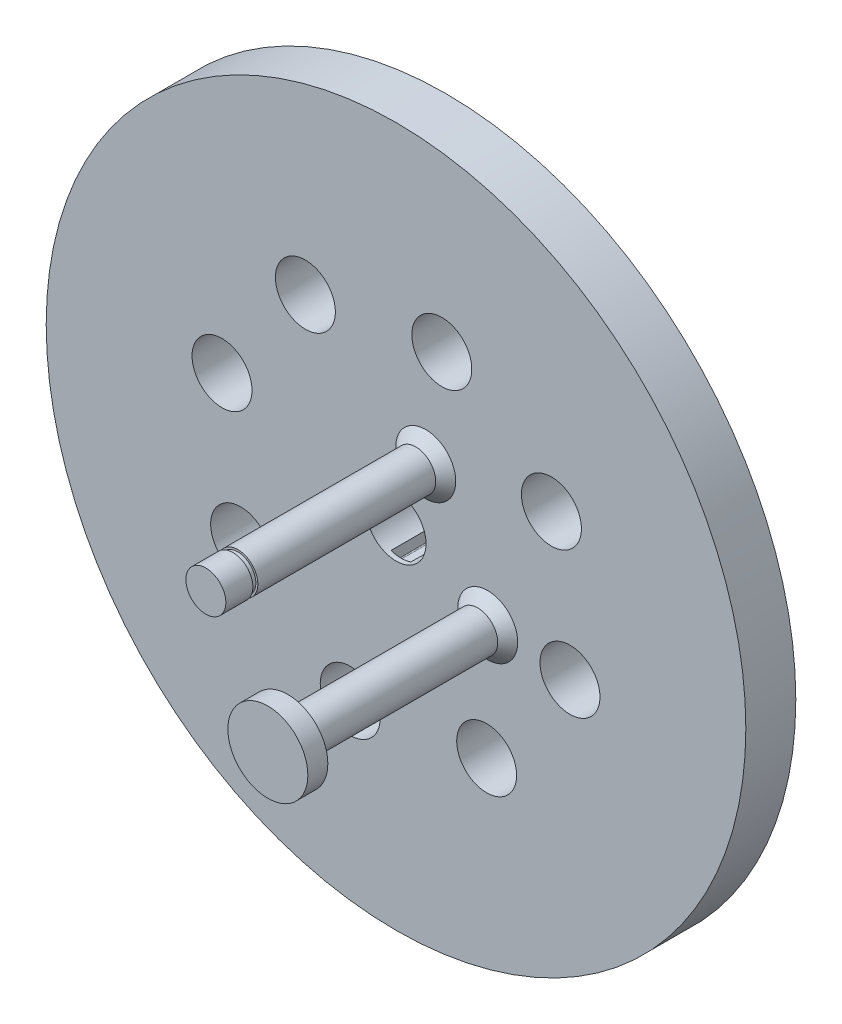
ISO-10303-21;
HEADER;
FILE_DESCRIPTION(('STEP AP214'),'2;1');
FILE_NAME('part.step','',(''),(''),'','','');
FILE_SCHEMA(('AUTOMOTIVE_DESIGN { 1 0 10303 214 1 1 1 1 }'));
ENDSEC;
DATA;
#1=APPLICATION_CONTEXT('core data for automotive mechanical design processes');
#2=APPLICATION_PROTOCOL_DEFINITION('international standard','automotive_design',2000,#1);
#3=PRODUCT_CONTEXT('',#1,'mechanical');
#4=PRODUCT('Part','Part','',(#3));
#5=PRODUCT_RELATED_PRODUCT_CATEGORY('part','',(#4));
#6=PRODUCT_DEFINITION_FORMATION('','',#4);
#7=PRODUCT_DEFINITION_CONTEXT('part definition',#1,'design');
#8=PRODUCT_DEFINITION('design','',#6,#7);
#9=PRODUCT_DEFINITION_SHAPE('','',#8);
#10=(LENGTH_UNIT() NAMED_UNIT(*) SI_UNIT(.MILLI.,.METRE.));
#11=(NAMED_UNIT(*) PLANE_ANGLE_UNIT() SI_UNIT($,.RADIAN.));
#12=(NAMED_UNIT(*) SI_UNIT($,.STERADIAN.) SOLID_ANGLE_UNIT());
#13=UNCERTAINTY_MEASURE_WITH_UNIT(LENGTH_MEASURE(1.E-05),#10,'distance_accuracy_value','');
#14=(GEOMETRIC_REPRESENTATION_CONTEXT(3) GLOBAL_UNCERTAINTY_ASSIGNED_CONTEXT((#13)) GLOBAL_UNIT_ASSIGNED_CONTEXT((#10,
#11,#12)) REPRESENTATION_CONTEXT('',''));
#15=CARTESIAN_POINT('',(0.,0.,0.));
#16=DIRECTION('',(0.,0.,1.));
#17=DIRECTION('',(1.,0.,0.));
#18=AXIS2_PLACEMENT_3D('',#15,#16,#17);
#19=CARTESIAN_POINT('',(0.,0.,5.));
#20=DIRECTION('',(0.,0.,-1.));
#21=DIRECTION('',(-1.,0.,0.));
#22=AXIS2_PLACEMENT_3D('',#19,#20,#21);
#23=CYLINDRICAL_SURFACE('',#22,3.);
#24=CARTESIAN_POINT('',(0.,0.,5.));
#25=DIRECTION('',(0.,0.,1.));
#26=DIRECTION('',(1.,0.,0.));
#27=AXIS2_PLACEMENT_3D('',#24,#25,#26);
#28=CIRCLE('',#27,3.);
#29=CARTESIAN_POINT('',(3.,0.,5.));
#30=VERTEX_POINT('',#29);
#31=EDGE_CURVE('E272',#30,#30,#28,.T.);
#32=ORIENTED_EDGE('',*,*,#31,.T.);
#33=EDGE_LOOP('',(#32));
#34=FACE_BOUND('',#33,.T.);
#35=CARTESIAN_POINT('',(0.,0.,0.));
#36=DIRECTION('',(0.,0.,1.));
#37=DIRECTION('',(1.,0.,0.));
#38=AXIS2_PLACEMENT_3D('',#35,#36,#37);
#39=CIRCLE('',#38,3.);
#40=CARTESIAN_POINT('',(3.,0.,0.));
#41=VERTEX_POINT('',#40);
#42=EDGE_CURVE('E268',#41,#41,#39,.T.);
#43=ORIENTED_EDGE('',*,*,#42,.F.);
#44=EDGE_LOOP('',(#43));
#45=FACE_BOUND('',#44,.T.);
#46=DIRECTION('',(0.,0.,-1.));
#47=VECTOR('',#46,1.);
#48=CARTESIAN_POINT('',(-0.999999999999999,-2.82842712474619,5.));
#49=LINE('',#48,#47);
#50=CARTESIAN_POINT('',(-0.999999999999999,-2.82842712474619,0.5));
#51=VERTEX_POINT('',#50);
#52=CARTESIAN_POINT('',(-0.999999999999999,-2.82842712474619,4.5));
#53=VERTEX_POINT('',#52);
#54=EDGE_CURVE('E129',#51,#53,#49,.F.);
#55=ORIENTED_EDGE('',*,*,#54,.F.);
#56=CARTESIAN_POINT('',(0.,0.,0.5));
#57=DIRECTION('',(0.,0.,1.));
#58=DIRECTION('',(1.,0.,0.));
#59=AXIS2_PLACEMENT_3D('',#56,#57,#58);
#60=CIRCLE('',#59,3.);
#61=CARTESIAN_POINT('',(1.,-2.82842712474619,0.5));
#62=VERTEX_POINT('',#61);
#63=EDGE_CURVE('E132',#51,#62,#60,.T.);
#64=ORIENTED_EDGE('',*,*,#63,.T.);
#65=DIRECTION('',(0.,0.,-1.));
#66=VECTOR('',#65,1.);
#67=CARTESIAN_POINT('',(1.,-2.82842712474619,5.));
#68=LINE('',#67,#66);
#69=CARTESIAN_POINT('',(1.,-2.82842712474619,4.5));
#70=VERTEX_POINT('',#69);
#71=EDGE_CURVE('E114',#70,#62,#68,.T.);
#72=ORIENTED_EDGE('',*,*,#71,.F.);
#73=CARTESIAN_POINT('',(0.,0.,4.5));
#74=DIRECTION('',(0.,0.,1.));
#75=DIRECTION('',(1.,0.,0.));
#76=AXIS2_PLACEMENT_3D('',#73,#74,#75);
#77=CIRCLE('',#76,3.);
#78=EDGE_CURVE('E122',#53,#70,#77,.T.);
#79=ORIENTED_EDGE('',*,*,#78,.F.);
#80=EDGE_LOOP('',(#55,#64,#72,#79));
#81=FACE_BOUND('',#80,.T.);
#82=ADVANCED_FACE('F53',(#34,#45,#81),#23,.F.);
#83=CARTESIAN_POINT('',(9.17867077053944,-3.96887929849786,27.));
#84=DIRECTION('',(0.,0.,-1.));
#85=DIRECTION('',(-1.,0.,0.));
#86=AXIS2_PLACEMENT_3D('',#83,#84,#85);
#87=CYLINDRICAL_SURFACE('',#86,2.);
#88=CARTESIAN_POINT('',(9.17867077053944,-3.96887929849786,6.00000000000001));
#89=DIRECTION('',(0.,0.,1.));
#90=DIRECTION('',(1.,0.,0.));
#91=AXIS2_PLACEMENT_3D('',#88,#89,#90);
#92=CIRCLE('',#91,2.);
#93=CARTESIAN_POINT('',(11.1786707705394,-3.96887929849786,6.00000000000001));
#94=VERTEX_POINT('',#93);
#95=EDGE_CURVE('E291',#94,#94,#92,.T.);
#96=ORIENTED_EDGE('',*,*,#95,.T.);
#97=EDGE_LOOP('',(#96));
#98=FACE_BOUND('',#97,.T.);
#99=CARTESIAN_POINT('',(9.17867077053944,-3.96887929849786,25.));
#100=DIRECTION('',(0.,0.,1.));
#101=DIRECTION('',(1.,0.,0.));
#102=AXIS2_PLACEMENT_3D('',#99,#100,#101);
#103=CIRCLE('',#102,2.);
#104=CARTESIAN_POINT('',(11.1786707705394,-3.96887929849786,25.));
#105=VERTEX_POINT('',#104);
#106=EDGE_CURVE('E284',#105,#105,#103,.T.);
#107=ORIENTED_EDGE('',*,*,#106,.F.);
#108=EDGE_LOOP('',(#107));
#109=FACE_BOUND('',#108,.T.);
#110=ADVANCED_FACE('F327',(#98,#109),#87,.T.);
#111=CARTESIAN_POINT('',(2.97665947387337,6.88400307790459,27.));
#112=DIRECTION('',(0.,0.,-1.));
#113=DIRECTION('',(-1.,0.,0.));
#114=AXIS2_PLACEMENT_3D('',#111,#112,#113);
#115=CYLINDRICAL_SURFACE('',#114,2.);
#116=CARTESIAN_POINT('',(2.97665947387337,6.88400307790459,6.00000000000001));
#117=DIRECTION('',(0.,0.,1.));
#118=DIRECTION('',(1.,0.,0.));
#119=AXIS2_PLACEMENT_3D('',#116,#117,#118);
#120=CIRCLE('',#119,2.);
#121=CARTESIAN_POINT('',(4.97665947387337,6.88400307790459,6.00000000000001));
#122=VERTEX_POINT('',#121);
#123=EDGE_CURVE('E130',#122,#122,#120,.T.);
#124=ORIENTED_EDGE('',*,*,#123,.T.);
#125=EDGE_LOOP('',(#124));
#126=FACE_BOUND('',#125,.T.);
#127=CARTESIAN_POINT('',(2.97665947387337,6.88400307790459,23.8));
#128=DIRECTION('',(0.,0.,1.));
#129=DIRECTION('',(1.,0.,0.));
#130=AXIS2_PLACEMENT_3D('',#127,#128,#129);
#131=CIRCLE('',#130,2.);
#132=CARTESIAN_POINT('',(4.97665947387337,6.88400307790459,23.8));
#133=VERTEX_POINT('',#132);
#134=EDGE_CURVE('E192',#133,#133,#131,.T.);
#135=ORIENTED_EDGE('',*,*,#134,.F.);
#136=EDGE_LOOP('',(#135));
#137=FACE_BOUND('',#136,.T.);
#138=ADVANCED_FACE('F307',(#126,#137),#115,.T.);
#139=CARTESIAN_POINT('',(0.,0.,5.));
#140=DIRECTION('',(0.,0.,1.));
#141=DIRECTION('',(1.,0.,0.));
#142=AXIS2_PLACEMENT_3D('',#139,#140,#141);
#143=PLANE('',#142);
#144=CARTESIAN_POINT('',(9.17867077053944,-3.96887929849786,5.));
#145=DIRECTION('',(0.,0.,1.));
#146=DIRECTION('',(1.,0.,0.));
#147=AXIS2_PLACEMENT_3D('',#144,#145,#146);
#148=CIRCLE('',#147,3.);
#149=CARTESIAN_POINT('',(12.1786707705394,-3.96887929849786,5.));
#150=VERTEX_POINT('',#149);
#151=EDGE_CURVE('E299',#150,#150,#148,.F.);
#152=ORIENTED_EDGE('',*,*,#151,.T.);
#153=EDGE_LOOP('',(#152));
#154=FACE_BOUND('',#153,.T.);
#155=CARTESIAN_POINT('',(2.97665947387337,6.88400307790459,5.));
#156=DIRECTION('',(0.,0.,1.));
#157=DIRECTION('',(1.,0.,0.));
#158=AXIS2_PLACEMENT_3D('',#155,#156,#157);
#159=CIRCLE('',#158,3.);
#160=CARTESIAN_POINT('',(5.97665947387337,6.88400307790459,5.));
#161=VERTEX_POINT('',#160);
#162=EDGE_CURVE('E295',#161,#161,#159,.F.);
#163=ORIENTED_EDGE('',*,*,#162,.T.);
#164=EDGE_LOOP('',(#163));
#165=FACE_BOUND('',#164,.T.);
#166=CARTESIAN_POINT('',(15.548658842396,9.06858358305098,5.));
#167=DIRECTION('',(0.,0.,-1.));
#168=DIRECTION('',(-1.,0.,0.));
#169=AXIS2_PLACEMENT_3D('',#166,#167,#168);
#170=CIRCLE('',#169,3.);
#171=CARTESIAN_POINT('',(12.548658842396,9.06858358305098,5.));
#172=VERTEX_POINT('',#171);
#173=EDGE_CURVE('E207',#172,#172,#170,.T.);
#174=ORIENTED_EDGE('',*,*,#173,.T.);
#175=EDGE_LOOP('',(#174));
#176=FACE_BOUND('',#175,.T.);
#177=CARTESIAN_POINT('',(17.4070190531467,-4.58210515848203,5.));
#178=DIRECTION('',(0.,0.,-1.));
#179=DIRECTION('',(-1.,0.,0.));
#180=AXIS2_PLACEMENT_3D('',#177,#178,#179);
#181=CIRCLE('',#180,3.);
#182=CARTESIAN_POINT('',(14.4070190531467,-4.58210515848203,5.));
#183=VERTEX_POINT('',#182);
#184=EDGE_CURVE('E253',#183,#183,#181,.T.);
#185=ORIENTED_EDGE('',*,*,#184,.T.);
#186=EDGE_LOOP('',(#185));
#187=FACE_BOUND('',#186,.T.);
#188=CARTESIAN_POINT('',(9.06858358305099,-15.5486588423959,5.));
#189=DIRECTION('',(0.,0.,-1.));
#190=DIRECTION('',(-1.,0.,0.));
#191=AXIS2_PLACEMENT_3D('',#188,#189,#190);
#192=CIRCLE('',#191,3.);
#193=CARTESIAN_POINT('',(6.06858358305099,-15.5486588423959,5.));
#194=VERTEX_POINT('',#193);
#195=EDGE_CURVE('E245',#194,#194,#192,.T.);
#196=ORIENTED_EDGE('',*,*,#195,.T.);
#197=EDGE_LOOP('',(#196));
#198=FACE_BOUND('',#197,.T.);
#199=CARTESIAN_POINT('',(-4.58210515848203,-17.4070190531467,5.));
#200=DIRECTION('',(0.,0.,-1.));
#201=DIRECTION('',(-1.,0.,0.));
#202=AXIS2_PLACEMENT_3D('',#199,#200,#201);
#203=CIRCLE('',#202,3.);
#204=CARTESIAN_POINT('',(-7.58210515848203,-17.4070190531467,5.));
#205=VERTEX_POINT('',#204);
#206=EDGE_CURVE('E237',#205,#205,#203,.T.);
#207=ORIENTED_EDGE('',*,*,#206,.T.);
#208=EDGE_LOOP('',(#207));
#209=FACE_BOUND('',#208,.T.);
#210=CARTESIAN_POINT('',(-15.548658842396,-9.06858358305097,5.));
#211=DIRECTION('',(0.,0.,-1.));
#212=DIRECTION('',(-1.,0.,0.));
#213=AXIS2_PLACEMENT_3D('',#210,#211,#212);
#214=CIRCLE('',#213,3.);
#215=CARTESIAN_POINT('',(-18.548658842396,-9.06858358305097,5.));
#216=VERTEX_POINT('',#215);
#217=EDGE_CURVE('E229',#216,#216,#214,.T.);
#218=ORIENTED_EDGE('',*,*,#217,.T.);
#219=EDGE_LOOP('',(#218));
#220=FACE_BOUND('',#219,.T.);
#221=CARTESIAN_POINT('',(-17.4070190531467,4.58210515848202,5.));
#222=DIRECTION('',(0.,0.,-1.));
#223=DIRECTION('',(-1.,0.,0.));
#224=AXIS2_PLACEMENT_3D('',#221,#222,#223);
#225=CIRCLE('',#224,2.99999999999999);
#226=CARTESIAN_POINT('',(-20.4070190531467,4.58210515848202,5.));
#227=VERTEX_POINT('',#226);
#228=EDGE_CURVE('E221',#227,#227,#225,.T.);
#229=ORIENTED_EDGE('',*,*,#228,.T.);
#230=EDGE_LOOP('',(#229));
#231=FACE_BOUND('',#230,.T.);
#232=CARTESIAN_POINT('',(-9.06858358305098,15.548658842396,5.));
#233=DIRECTION('',(0.,0.,-1.));
#234=DIRECTION('',(-1.,0.,0.));
#235=AXIS2_PLACEMENT_3D('',#232,#233,#234);
#236=CIRCLE('',#235,3.);
#237=CARTESIAN_POINT('',(-12.068583583051,15.548658842396,5.));
#238=VERTEX_POINT('',#237);
#239=EDGE_CURVE('E213',#238,#238,#236,.T.);
#240=ORIENTED_EDGE('',*,*,#239,.T.);
#241=EDGE_LOOP('',(#240));
#242=FACE_BOUND('',#241,.T.);
#243=CARTESIAN_POINT('',(4.58210515848201,17.4070190531467,5.));
#244=DIRECTION('',(0.,0.,-1.));
#245=DIRECTION('',(-1.,0.,0.));
#246=AXIS2_PLACEMENT_3D('',#243,#244,#245);
#247=CIRCLE('',#246,3.);
#248=CARTESIAN_POINT('',(1.58210515848201,17.4070190531467,5.));
#249=VERTEX_POINT('',#248);
#250=EDGE_CURVE('E264',#249,#249,#247,.T.);
#251=ORIENTED_EDGE('',*,*,#250,.T.);
#252=EDGE_LOOP('',(#251));
#253=FACE_BOUND('',#252,.T.);
#254=CARTESIAN_POINT('',(0.,0.,5.));
#255=DIRECTION('',(0.,0.,1.));
#256=DIRECTION('',(1.,0.,0.));
#257=AXIS2_PLACEMENT_3D('',#254,#255,#256);
#258=CIRCLE('',#257,35.);
#259=CARTESIAN_POINT('',(35.,0.,5.));
#260=VERTEX_POINT('',#259);
#261=EDGE_CURVE('E280',#260,#260,#258,.T.);
#262=ORIENTED_EDGE('',*,*,#261,.T.);
#263=EDGE_LOOP('',(#262));
#264=FACE_BOUND('',#263,.T.);
#265=ORIENTED_EDGE('',*,*,#31,.F.);
#266=EDGE_LOOP('',(#265));
#267=FACE_BOUND('',#266,.T.);
#268=ADVANCED_FACE('F341',(#154,#165,#176,#187,#198,#209,#220,#231,#242,#253,#264,#267),#143,.T.);
#269=CARTESIAN_POINT('',(0.,0.,0.));
#270=DIRECTION('',(0.,0.,1.));
#271=DIRECTION('',(1.,0.,0.));
#272=AXIS2_PLACEMENT_3D('',#269,#270,#271);
#273=PLANE('',#272);
#274=CARTESIAN_POINT('',(15.548658842396,9.06858358305098,0.));
#275=DIRECTION('',(0.,0.,-1.));
#276=DIRECTION('',(-1.,0.,0.));
#277=AXIS2_PLACEMENT_3D('',#274,#275,#276);
#278=CIRCLE('',#277,3.);
#279=CARTESIAN_POINT('',(12.548658842396,9.06858358305098,0.));
#280=VERTEX_POINT('',#279);
#281=EDGE_CURVE('E257',#280,#280,#278,.T.);
#282=ORIENTED_EDGE('',*,*,#281,.F.);
#283=EDGE_LOOP('',(#282));
#284=FACE_BOUND('',#283,.T.);
#285=CARTESIAN_POINT('',(17.4070190531467,-4.58210515848203,0.));
#286=DIRECTION('',(0.,0.,-1.));
#287=DIRECTION('',(-1.,0.,0.));
#288=AXIS2_PLACEMENT_3D('',#285,#286,#287);
#289=CIRCLE('',#288,3.);
#290=CARTESIAN_POINT('',(14.4070190531467,-4.58210515848203,0.));
#291=VERTEX_POINT('',#290);
#292=EDGE_CURVE('E249',#291,#291,#289,.T.);
#293=ORIENTED_EDGE('',*,*,#292,.F.);
#294=EDGE_LOOP('',(#293));
#295=FACE_BOUND('',#294,.T.);
#296=CARTESIAN_POINT('',(9.06858358305099,-15.5486588423959,0.));
#297=DIRECTION('',(0.,0.,-1.));
#298=DIRECTION('',(-1.,0.,0.));
#299=AXIS2_PLACEMENT_3D('',#296,#297,#298);
#300=CIRCLE('',#299,3.);
#301=CARTESIAN_POINT('',(6.06858358305099,-15.5486588423959,0.));
#302=VERTEX_POINT('',#301);
#303=EDGE_CURVE('E241',#302,#302,#300,.T.);
#304=ORIENTED_EDGE('',*,*,#303,.F.);
#305=EDGE_LOOP('',(#304));
#306=FACE_BOUND('',#305,.T.);
#307=CARTESIAN_POINT('',(-4.58210515848203,-17.4070190531467,0.));
#308=DIRECTION('',(0.,0.,-1.));
#309=DIRECTION('',(-1.,0.,0.));
#310=AXIS2_PLACEMENT_3D('',#307,#308,#309);
#311=CIRCLE('',#310,3.);
#312=CARTESIAN_POINT('',(-7.58210515848203,-17.4070190531467,0.));
#313=VERTEX_POINT('',#312);
#314=EDGE_CURVE('E233',#313,#313,#311,.T.);
#315=ORIENTED_EDGE('',*,*,#314,.F.);
#316=EDGE_LOOP('',(#315));
#317=FACE_BOUND('',#316,.T.);
#318=CARTESIAN_POINT('',(-15.548658842396,-9.06858358305097,0.));
#319=DIRECTION('',(0.,0.,-1.));
#320=DIRECTION('',(-1.,0.,0.));
#321=AXIS2_PLACEMENT_3D('',#318,#319,#320);
#322=CIRCLE('',#321,3.);
#323=CARTESIAN_POINT('',(-18.548658842396,-9.06858358305097,0.));
#324=VERTEX_POINT('',#323);
#325=EDGE_CURVE('E225',#324,#324,#322,.T.);
#326=ORIENTED_EDGE('',*,*,#325,.F.);
#327=EDGE_LOOP('',(#326));
#328=FACE_BOUND('',#327,.T.);
#329=CARTESIAN_POINT('',(-17.4070190531467,4.58210515848202,0.));
#330=DIRECTION('',(0.,0.,-1.));
#331=DIRECTION('',(-1.,0.,0.));
#332=AXIS2_PLACEMENT_3D('',#329,#330,#331);
#333=CIRCLE('',#332,2.99999999999999);
#334=CARTESIAN_POINT('',(-20.4070190531467,4.58210515848202,0.));
#335=VERTEX_POINT('',#334);
#336=EDGE_CURVE('E217',#335,#335,#333,.T.);
#337=ORIENTED_EDGE('',*,*,#336,.F.);
#338=EDGE_LOOP('',(#337));
#339=FACE_BOUND('',#338,.T.);
#340=CARTESIAN_POINT('',(-9.06858358305098,15.548658842396,0.));
#341=DIRECTION('',(0.,0.,-1.));
#342=DIRECTION('',(-1.,0.,0.));
#343=AXIS2_PLACEMENT_3D('',#340,#341,#342);
#344=CIRCLE('',#343,3.);
#345=CARTESIAN_POINT('',(-12.068583583051,15.548658842396,0.));
#346=VERTEX_POINT('',#345);
#347=EDGE_CURVE('E208',#346,#346,#344,.T.);
#348=ORIENTED_EDGE('',*,*,#347,.F.);
#349=EDGE_LOOP('',(#348));
#350=FACE_BOUND('',#349,.T.);
#351=CARTESIAN_POINT('',(4.58210515848201,17.4070190531467,0.));
#352=DIRECTION('',(0.,0.,-1.));
#353=DIRECTION('',(-1.,0.,0.));
#354=AXIS2_PLACEMENT_3D('',#351,#352,#353);
#355=CIRCLE('',#354,3.);
#356=CARTESIAN_POINT('',(1.58210515848201,17.4070190531467,0.));
#357=VERTEX_POINT('',#356);
#358=EDGE_CURVE('E212',#357,#357,#355,.T.);
#359=ORIENTED_EDGE('',*,*,#358,.F.);
#360=EDGE_LOOP('',(#359));
#361=FACE_BOUND('',#360,.T.);
#362=CARTESIAN_POINT('',(0.,0.,0.));
#363=DIRECTION('',(0.,0.,1.));
#364=DIRECTION('',(1.,0.,0.));
#365=AXIS2_PLACEMENT_3D('',#362,#363,#364);
#366=CIRCLE('',#365,35.);
#367=CARTESIAN_POINT('',(35.,0.,0.));
#368=VERTEX_POINT('',#367);
#369=EDGE_CURVE('E276',#368,#368,#366,.T.);
#370=ORIENTED_EDGE('',*,*,#369,.F.);
#371=EDGE_LOOP('',(#370));
#372=FACE_BOUND('',#371,.T.);
#373=ORIENTED_EDGE('',*,*,#42,.T.);
#374=EDGE_LOOP('',(#373));
#375=FACE_BOUND('',#374,.T.);
#376=ADVANCED_FACE('F343',(#284,#295,#306,#317,#328,#339,#350,#361,#372,#375),#273,.F.);
#377=CARTESIAN_POINT('',(0.,0.,5.));
#378=DIRECTION('',(0.,0.,-1.));
#379=DIRECTION('',(-1.,0.,0.));
#380=AXIS2_PLACEMENT_3D('',#377,#378,#379);
#381=CYLINDRICAL_SURFACE('',#380,35.);
#382=ORIENTED_EDGE('',*,*,#261,.F.);
#383=EDGE_LOOP('',(#382));
#384=FACE_BOUND('',#383,.T.);
#385=ORIENTED_EDGE('',*,*,#369,.T.);
#386=EDGE_LOOP('',(#385));
#387=FACE_BOUND('',#386,.T.);
#388=ADVANCED_FACE('F347',(#384,#387),#381,.T.);
#389=CARTESIAN_POINT('',(4.58210515848201,17.4070190531467,5.));
#390=DIRECTION('',(0.,0.,-1.));
#391=DIRECTION('',(-1.,0.,0.));
#392=AXIS2_PLACEMENT_3D('',#389,#390,#391);
#393=CYLINDRICAL_SURFACE('',#392,3.);
#394=ORIENTED_EDGE('',*,*,#250,.F.);
#395=EDGE_LOOP('',(#394));
#396=FACE_BOUND('',#395,.T.);
#397=ORIENTED_EDGE('',*,*,#358,.T.);
#398=EDGE_LOOP('',(#397));
#399=FACE_BOUND('',#398,.T.);
#400=ADVANCED_FACE('F339',(#396,#399),#393,.F.);
#401=CARTESIAN_POINT('',(-9.06858358305098,15.548658842396,5.));
#402=DIRECTION('',(0.,0.,-1.));
#403=DIRECTION('',(-1.,0.,0.));
#404=AXIS2_PLACEMENT_3D('',#401,#402,#403);
#405=CYLINDRICAL_SURFACE('',#404,3.);
#406=ORIENTED_EDGE('',*,*,#239,.F.);
#407=EDGE_LOOP('',(#406));
#408=FACE_BOUND('',#407,.T.);
#409=ORIENTED_EDGE('',*,*,#347,.T.);
#410=EDGE_LOOP('',(#409));
#411=FACE_BOUND('',#410,.T.);
#412=ADVANCED_FACE('F359',(#408,#411),#405,.F.);
#413=CARTESIAN_POINT('',(-17.4070190531467,4.58210515848202,5.));
#414=DIRECTION('',(0.,0.,-1.));
#415=DIRECTION('',(-1.,0.,0.));
#416=AXIS2_PLACEMENT_3D('',#413,#414,#415);
#417=CYLINDRICAL_SURFACE('',#416,2.99999999999999);
#418=ORIENTED_EDGE('',*,*,#228,.F.);
#419=EDGE_LOOP('',(#418));
#420=FACE_BOUND('',#419,.T.);
#421=ORIENTED_EDGE('',*,*,#336,.T.);
#422=EDGE_LOOP('',(#421));
#423=FACE_BOUND('',#422,.T.);
#424=ADVANCED_FACE('F374',(#420,#423),#417,.F.);
#425=CARTESIAN_POINT('',(-15.548658842396,-9.06858358305097,5.));
#426=DIRECTION('',(0.,0.,-1.));
#427=DIRECTION('',(-1.,0.,0.));
#428=AXIS2_PLACEMENT_3D('',#425,#426,#427);
#429=CYLINDRICAL_SURFACE('',#428,3.);
#430=ORIENTED_EDGE('',*,*,#217,.F.);
#431=EDGE_LOOP('',(#430));
#432=FACE_BOUND('',#431,.T.);
#433=ORIENTED_EDGE('',*,*,#325,.T.);
#434=EDGE_LOOP('',(#433));
#435=FACE_BOUND('',#434,.T.);
#436=ADVANCED_FACE('F385',(#432,#435),#429,.F.);
#437=CARTESIAN_POINT('',(-4.58210515848203,-17.4070190531467,5.));
#438=DIRECTION('',(0.,0.,-1.));
#439=DIRECTION('',(-1.,0.,0.));
#440=AXIS2_PLACEMENT_3D('',#437,#438,#439);
#441=CYLINDRICAL_SURFACE('',#440,3.);
#442=ORIENTED_EDGE('',*,*,#206,.F.);
#443=EDGE_LOOP('',(#442));
#444=FACE_BOUND('',#443,.T.);
#445=ORIENTED_EDGE('',*,*,#314,.T.);
#446=EDGE_LOOP('',(#445));
#447=FACE_BOUND('',#446,.T.);
#448=ADVANCED_FACE('F396',(#444,#447),#441,.F.);
#449=CARTESIAN_POINT('',(9.06858358305099,-15.5486588423959,5.));
#450=DIRECTION('',(0.,0.,-1.));
#451=DIRECTION('',(-1.,0.,0.));
#452=AXIS2_PLACEMENT_3D('',#449,#450,#451);
#453=CYLINDRICAL_SURFACE('',#452,3.);
#454=ORIENTED_EDGE('',*,*,#195,.F.);
#455=EDGE_LOOP('',(#454));
#456=FACE_BOUND('',#455,.T.);
#457=ORIENTED_EDGE('',*,*,#303,.T.);
#458=EDGE_LOOP('',(#457));
#459=FACE_BOUND('',#458,.T.);
#460=ADVANCED_FACE('F400',(#456,#459),#453,.F.);
#461=CARTESIAN_POINT('',(17.4070190531467,-4.58210515848203,5.));
#462=DIRECTION('',(0.,0.,-1.));
#463=DIRECTION('',(-1.,0.,0.));
#464=AXIS2_PLACEMENT_3D('',#461,#462,#463);
#465=CYLINDRICAL_SURFACE('',#464,3.);
#466=ORIENTED_EDGE('',*,*,#184,.F.);
#467=EDGE_LOOP('',(#466));
#468=FACE_BOUND('',#467,.T.);
#469=ORIENTED_EDGE('',*,*,#292,.T.);
#470=EDGE_LOOP('',(#469));
#471=FACE_BOUND('',#470,.T.);
#472=ADVANCED_FACE('F404',(#468,#471),#465,.F.);
#473=CARTESIAN_POINT('',(15.548658842396,9.06858358305098,5.));
#474=DIRECTION('',(0.,0.,-1.));
#475=DIRECTION('',(-1.,0.,0.));
#476=AXIS2_PLACEMENT_3D('',#473,#474,#475);
#477=CYLINDRICAL_SURFACE('',#476,3.);
#478=ORIENTED_EDGE('',*,*,#173,.F.);
#479=EDGE_LOOP('',(#478));
#480=FACE_BOUND('',#479,.T.);
#481=ORIENTED_EDGE('',*,*,#281,.T.);
#482=EDGE_LOOP('',(#481));
#483=FACE_BOUND('',#482,.T.);
#484=ADVANCED_FACE('F407',(#480,#483),#477,.F.);
#485=CARTESIAN_POINT('',(2.97665947387337,6.88400307790459,24.3));
#486=DIRECTION('',(0.,0.,1.));
#487=DIRECTION('',(1.,0.,0.));
#488=AXIS2_PLACEMENT_3D('',#485,#486,#487);
#489=PLANE('',#488);
#490=CARTESIAN_POINT('',(2.97665947387337,6.88400307790459,24.3));
#491=DIRECTION('',(0.,0.,1.));
#492=DIRECTION('',(1.,0.,0.));
#493=AXIS2_PLACEMENT_3D('',#490,#491,#492);
#494=CIRCLE('',#493,2.);
#495=CARTESIAN_POINT('',(4.97665947387337,6.88400307790459,24.3));
#496=VERTEX_POINT('',#495);
#497=EDGE_CURVE('E196',#496,#496,#494,.T.);
#498=ORIENTED_EDGE('',*,*,#497,.F.);
#499=EDGE_LOOP('',(#498));
#500=FACE_BOUND('',#499,.T.);
#501=CARTESIAN_POINT('',(2.97665947387337,6.88400307790459,24.3));
#502=DIRECTION('',(0.,0.,1.));
#503=DIRECTION('',(1.,0.,0.));
#504=AXIS2_PLACEMENT_3D('',#501,#502,#503);
#505=CIRCLE('',#504,1.8);
#506=CARTESIAN_POINT('',(4.77665947387337,6.88400307790459,24.3));
#507=VERTEX_POINT('',#506);
#508=EDGE_CURVE('E188',#507,#507,#505,.T.);
#509=ORIENTED_EDGE('',*,*,#508,.T.);
#510=EDGE_LOOP('',(#509));
#511=FACE_BOUND('',#510,.T.);
#512=ADVANCED_FACE('F410',(#500,#511),#489,.F.);
#513=CARTESIAN_POINT('',(2.97665947387337,6.88400307790459,23.8));
#514=DIRECTION('',(0.,0.,1.));
#515=DIRECTION('',(1.,0.,0.));
#516=AXIS2_PLACEMENT_3D('',#513,#514,#515);
#517=PLANE('',#516);
#518=ORIENTED_EDGE('',*,*,#134,.T.);
#519=EDGE_LOOP('',(#518));
#520=FACE_BOUND('',#519,.T.);
#521=CARTESIAN_POINT('',(2.97665947387337,6.88400307790459,23.8));
#522=DIRECTION('',(0.,0.,1.));
#523=DIRECTION('',(1.,0.,0.));
#524=AXIS2_PLACEMENT_3D('',#521,#522,#523);
#525=CIRCLE('',#524,1.8);
#526=CARTESIAN_POINT('',(4.77665947387337,6.88400307790459,23.8));
#527=VERTEX_POINT('',#526);
#528=EDGE_CURVE('E184',#527,#527,#525,.T.);
#529=ORIENTED_EDGE('',*,*,#528,.F.);
#530=EDGE_LOOP('',(#529));
#531=FACE_BOUND('',#530,.T.);
#532=ADVANCED_FACE('F416',(#520,#531),#517,.T.);
#533=CARTESIAN_POINT('',(2.97665947387337,6.88400307790459,24.3));
#534=DIRECTION('',(0.,0.,-1.));
#535=DIRECTION('',(-1.,0.,0.));
#536=AXIS2_PLACEMENT_3D('',#533,#534,#535);
#537=CYLINDRICAL_SURFACE('',#536,1.8);
#538=ORIENTED_EDGE('',*,*,#508,.F.);
#539=EDGE_LOOP('',(#538));
#540=FACE_BOUND('',#539,.T.);
#541=ORIENTED_EDGE('',*,*,#528,.T.);
#542=EDGE_LOOP('',(#541));
#543=FACE_BOUND('',#542,.T.);
#544=ADVANCED_FACE('F454',(#540,#543),#537,.T.);
#545=CARTESIAN_POINT('',(2.97665947387337,6.88400307790459,27.));
#546=DIRECTION('',(0.,0.,1.));
#547=DIRECTION('',(1.,0.,0.));
#548=AXIS2_PLACEMENT_3D('',#545,#546,#547);
#549=PLANE('',#548);
#550=CARTESIAN_POINT('',(2.97665947387337,6.88400307790459,27.));
#551=DIRECTION('',(0.,0.,1.));
#552=DIRECTION('',(1.,0.,0.));
#553=AXIS2_PLACEMENT_3D('',#550,#551,#552);
#554=CIRCLE('',#553,2.);
#555=CARTESIAN_POINT('',(4.97665947387337,6.88400307790459,27.));
#556=VERTEX_POINT('',#555);
#557=EDGE_CURVE('E200',#556,#556,#554,.T.);
#558=ORIENTED_EDGE('',*,*,#557,.T.);
#559=EDGE_LOOP('',(#558));
#560=FACE_BOUND('',#559,.T.);
#561=ADVANCED_FACE('F465',(#560),#549,.T.);
#562=ORIENTED_EDGE('',*,*,#497,.T.);
#563=EDGE_LOOP('',(#562));
#564=FACE_BOUND('',#563,.T.);
#565=ORIENTED_EDGE('',*,*,#557,.F.);
#566=EDGE_LOOP('',(#565));
#567=FACE_BOUND('',#566,.T.);
#568=ADVANCED_FACE('F391',(#564,#567),#115,.T.);
#569=CARTESIAN_POINT('',(9.17867077053944,-3.96887929849786,25.));
#570=DIRECTION('',(0.,0.,1.));
#571=DIRECTION('',(1.,0.,0.));
#572=AXIS2_PLACEMENT_3D('',#569,#570,#571);
#573=CYLINDRICAL_SURFACE('',#572,4.);
#574=CARTESIAN_POINT('',(9.17867077053944,-3.96887929849786,25.));
#575=DIRECTION('',(0.,0.,1.));
#576=DIRECTION('',(1.,0.,0.));
#577=AXIS2_PLACEMENT_3D('',#574,#575,#576);
#578=CIRCLE('',#577,4.);
#579=CARTESIAN_POINT('',(13.1786707705394,-3.96887929849786,25.));
#580=VERTEX_POINT('',#579);
#581=EDGE_CURVE('E180',#580,#580,#578,.T.);
#582=ORIENTED_EDGE('',*,*,#581,.T.);
#583=EDGE_LOOP('',(#582));
#584=FACE_BOUND('',#583,.T.);
#585=CARTESIAN_POINT('',(9.17867077053944,-3.96887929849786,27.));
#586=DIRECTION('',(0.,0.,1.));
#587=DIRECTION('',(1.,0.,0.));
#588=AXIS2_PLACEMENT_3D('',#585,#586,#587);
#589=CIRCLE('',#588,4.);
#590=CARTESIAN_POINT('',(13.1786707705394,-3.96887929849786,27.));
#591=VERTEX_POINT('',#590);
#592=EDGE_CURVE('E169',#591,#591,#589,.T.);
#593=ORIENTED_EDGE('',*,*,#592,.F.);
#594=EDGE_LOOP('',(#593));
#595=FACE_BOUND('',#594,.T.);
#596=ADVANCED_FACE('F470',(#584,#595),#573,.T.);
#597=CARTESIAN_POINT('',(9.17867077053944,-3.96887929849786,25.));
#598=DIRECTION('',(0.,0.,1.));
#599=DIRECTION('',(1.,0.,0.));
#600=AXIS2_PLACEMENT_3D('',#597,#598,#599);
#601=PLANE('',#600);
#602=ORIENTED_EDGE('',*,*,#106,.T.);
#603=EDGE_LOOP('',(#602));
#604=FACE_BOUND('',#603,.T.);
#605=ORIENTED_EDGE('',*,*,#581,.F.);
#606=EDGE_LOOP('',(#605));
#607=FACE_BOUND('',#606,.T.);
#608=ADVANCED_FACE('F463',(#604,#607),#601,.F.);
#609=CARTESIAN_POINT('',(9.17867077053944,-3.96887929849786,27.));
#610=DIRECTION('',(0.,0.,1.));
#611=DIRECTION('',(1.,0.,0.));
#612=AXIS2_PLACEMENT_3D('',#609,#610,#611);
#613=PLANE('',#612);
#614=ORIENTED_EDGE('',*,*,#592,.T.);
#615=EDGE_LOOP('',(#614));
#616=FACE_BOUND('',#615,.T.);
#617=ADVANCED_FACE('F321',(#616),#613,.T.);
#618=CARTESIAN_POINT('',(9.17867077053944,-3.96887929849786,6.00000000000001));
#619=DIRECTION('',(0.,0.,-1.));
#620=DIRECTION('',(-1.,0.,0.));
#621=AXIS2_PLACEMENT_3D('',#618,#619,#620);
#622=CONICAL_SURFACE('',#621,2.,0.785398163397446);
#623=ORIENTED_EDGE('',*,*,#151,.F.);
#624=EDGE_LOOP('',(#623));
#625=FACE_BOUND('',#624,.T.);
#626=ORIENTED_EDGE('',*,*,#95,.F.);
#627=EDGE_LOOP('',(#626));
#628=FACE_BOUND('',#627,.T.);
#629=ADVANCED_FACE('F312',(#625,#628),#622,.T.);
#630=CARTESIAN_POINT('',(2.97665947387337,6.88400307790459,6.00000000000001));
#631=DIRECTION('',(0.,0.,-1.));
#632=DIRECTION('',(-1.,0.,0.));
#633=AXIS2_PLACEMENT_3D('',#630,#631,#632);
#634=CONICAL_SURFACE('',#633,2.,0.785398163397446);
#635=ORIENTED_EDGE('',*,*,#162,.F.);
#636=EDGE_LOOP('',(#635));
#637=FACE_BOUND('',#636,.T.);
#638=ORIENTED_EDGE('',*,*,#123,.F.);
#639=EDGE_LOOP('',(#638));
#640=FACE_BOUND('',#639,.T.);
#641=ADVANCED_FACE('F310',(#637,#640),#634,.T.);
#642=CARTESIAN_POINT('',(1.,-2.,0.5));
#643=DIRECTION('',(1.,0.,0.));
#644=DIRECTION('',(0.,0.,-1.));
#645=AXIS2_PLACEMENT_3D('',#642,#643,#644);
#646=PLANE('',#645);
#647=DIRECTION('',(0.,1.,0.));
#648=VECTOR('',#647,1.);
#649=CARTESIAN_POINT('',(1.,-2.,0.5));
#650=LINE('',#649,#648);
#651=CARTESIAN_POINT('',(1.,-3.9,0.5));
#652=VERTEX_POINT('',#651);
#653=EDGE_CURVE('E177',#652,#62,#650,.T.);
#654=ORIENTED_EDGE('',*,*,#653,.F.);
#655=DIRECTION('',(0.,0.,1.));
#656=VECTOR('',#655,1.);
#657=CARTESIAN_POINT('',(1.,-3.9,4.5));
#658=LINE('',#657,#656);
#659=CARTESIAN_POINT('',(1.,-3.9,4.5));
#660=VERTEX_POINT('',#659);
#661=EDGE_CURVE('E11',#652,#660,#658,.T.);
#662=ORIENTED_EDGE('',*,*,#661,.T.);
#663=DIRECTION('',(0.,1.,0.));
#664=VECTOR('',#663,1.);
#665=CARTESIAN_POINT('',(1.,-2.,4.5));
#666=LINE('',#665,#664);
#667=EDGE_CURVE('E110',#660,#70,#666,.T.);
#668=ORIENTED_EDGE('',*,*,#667,.T.);
#669=ORIENTED_EDGE('',*,*,#71,.T.);
#670=EDGE_LOOP('',(#654,#662,#668,#669));
#671=FACE_BOUND('',#670,.T.);
#672=ADVANCED_FACE('F112',(#671),#646,.F.);
#673=CARTESIAN_POINT('',(-0.999999999999999,-4.,0.5));
#674=DIRECTION('',(0.,-1.,0.));
#675=DIRECTION('',(0.,0.,-1.));
#676=AXIS2_PLACEMENT_3D('',#673,#674,#675);
#677=PLANE('',#676);
#678=DIRECTION('',(1.,0.,0.));
#679=VECTOR('',#678,1.);
#680=CARTESIAN_POINT('',(-0.999999999999999,-4.,0.5));
#681=LINE('',#680,#679);
#682=CARTESIAN_POINT('',(-0.899999999999999,-4.,0.5));
#683=VERTEX_POINT('',#682);
#684=CARTESIAN_POINT('',(0.900000000000001,-4.,0.5));
#685=VERTEX_POINT('',#684);
#686=EDGE_CURVE('E160',#683,#685,#681,.T.);
#687=ORIENTED_EDGE('',*,*,#686,.F.);
#688=DIRECTION('',(0.,0.,1.));
#689=VECTOR('',#688,1.);
#690=CARTESIAN_POINT('',(-0.899999999999999,-4.,4.5));
#691=LINE('',#690,#689);
#692=CARTESIAN_POINT('',(-0.899999999999999,-4.,4.5));
#693=VERTEX_POINT('',#692);
#694=EDGE_CURVE('E143',#683,#693,#691,.T.);
#695=ORIENTED_EDGE('',*,*,#694,.T.);
#696=DIRECTION('',(1.,0.,0.));
#697=VECTOR('',#696,1.);
#698=CARTESIAN_POINT('',(-0.999999999999999,-4.,4.5));
#699=LINE('',#698,#697);
#700=CARTESIAN_POINT('',(0.900000000000001,-4.,4.5));
#701=VERTEX_POINT('',#700);
#702=EDGE_CURVE('E172',#693,#701,#699,.T.);
#703=ORIENTED_EDGE('',*,*,#702,.T.);
#704=DIRECTION('',(0.,0.,1.));
#705=VECTOR('',#704,1.);
#706=CARTESIAN_POINT('',(0.900000000000001,-4.,0.5));
#707=LINE('',#706,#705);
#708=EDGE_CURVE('E137',#701,#685,#707,.F.);
#709=ORIENTED_EDGE('',*,*,#708,.T.);
#710=EDGE_LOOP('',(#687,#695,#703,#709));
#711=FACE_BOUND('',#710,.T.);
#712=ADVANCED_FACE('F165',(#711),#677,.F.);
#713=CARTESIAN_POINT('',(-0.999999999999999,-2.,0.5));
#714=DIRECTION('',(-1.,0.,0.));
#715=DIRECTION('',(0.,0.,1.));
#716=AXIS2_PLACEMENT_3D('',#713,#714,#715);
#717=PLANE('',#716);
#718=DIRECTION('',(0.,-1.,0.));
#719=VECTOR('',#718,1.);
#720=CARTESIAN_POINT('',(-0.999999999999999,-2.,4.5));
#721=LINE('',#720,#719);
#722=CARTESIAN_POINT('',(-0.999999999999999,-3.9,4.5));
#723=VERTEX_POINT('',#722);
#724=EDGE_CURVE('E119',#53,#723,#721,.T.);
#725=ORIENTED_EDGE('',*,*,#724,.T.);
#726=DIRECTION('',(0.,0.,1.));
#727=VECTOR('',#726,1.);
#728=CARTESIAN_POINT('',(-0.999999999999999,-3.9,0.5));
#729=LINE('',#728,#727);
#730=CARTESIAN_POINT('',(-0.999999999999999,-3.9,0.5));
#731=VERTEX_POINT('',#730);
#732=EDGE_CURVE('E77',#723,#731,#729,.F.);
#733=ORIENTED_EDGE('',*,*,#732,.T.);
#734=DIRECTION('',(0.,-1.,0.));
#735=VECTOR('',#734,1.);
#736=CARTESIAN_POINT('',(-0.999999999999999,-2.,0.5));
#737=LINE('',#736,#735);
#738=EDGE_CURVE('E161',#51,#731,#737,.T.);
#739=ORIENTED_EDGE('',*,*,#738,.F.);
#740=ORIENTED_EDGE('',*,*,#54,.T.);
#741=EDGE_LOOP('',(#725,#733,#739,#740));
#742=FACE_BOUND('',#741,.T.);
#743=ADVANCED_FACE('F173',(#742),#717,.F.);
#744=CARTESIAN_POINT('',(0.,0.,0.5));
#745=DIRECTION('',(0.,0.,1.));
#746=DIRECTION('',(1.,0.,0.));
#747=AXIS2_PLACEMENT_3D('',#744,#745,#746);
#748=PLANE('',#747);
#749=ORIENTED_EDGE('',*,*,#738,.T.);
#750=CARTESIAN_POINT('',(-0.899999999999999,-3.9,0.5));
#751=DIRECTION('',(0.,0.,1.));
#752=DIRECTION('',(1.,0.,0.));
#753=AXIS2_PLACEMENT_3D('',#750,#751,#752);
#754=CIRCLE('',#753,0.1);
#755=EDGE_CURVE('E62',#731,#683,#754,.T.);
#756=ORIENTED_EDGE('',*,*,#755,.T.);
#757=ORIENTED_EDGE('',*,*,#686,.T.);
#758=CARTESIAN_POINT('',(0.900000000000001,-3.9,0.5));
#759=DIRECTION('',(0.,0.,1.));
#760=DIRECTION('',(1.,0.,0.));
#761=AXIS2_PLACEMENT_3D('',#758,#759,#760);
#762=CIRCLE('',#761,0.1);
#763=EDGE_CURVE('E69',#685,#652,#762,.T.);
#764=ORIENTED_EDGE('',*,*,#763,.T.);
#765=ORIENTED_EDGE('',*,*,#653,.T.);
#766=ORIENTED_EDGE('',*,*,#63,.F.);
#767=EDGE_LOOP('',(#749,#756,#757,#764,#765,#766));
#768=FACE_BOUND('',#767,.T.);
#769=ADVANCED_FACE('F159',(#768),#748,.T.);
#770=CARTESIAN_POINT('',(0.,0.,4.5));
#771=DIRECTION('',(0.,0.,1.));
#772=DIRECTION('',(1.,0.,0.));
#773=AXIS2_PLACEMENT_3D('',#770,#771,#772);
#774=PLANE('',#773);
#775=ORIENTED_EDGE('',*,*,#702,.F.);
#776=CARTESIAN_POINT('',(-0.899999999999999,-3.9,4.5));
#777=DIRECTION('',(0.,0.,1.));
#778=DIRECTION('',(1.,0.,0.));
#779=AXIS2_PLACEMENT_3D('',#776,#777,#778);
#780=CIRCLE('',#779,0.1);
#781=EDGE_CURVE('E150',#693,#723,#780,.F.);
#782=ORIENTED_EDGE('',*,*,#781,.T.);
#783=ORIENTED_EDGE('',*,*,#724,.F.);
#784=ORIENTED_EDGE('',*,*,#78,.T.);
#785=ORIENTED_EDGE('',*,*,#667,.F.);
#786=CARTESIAN_POINT('',(0.900000000000001,-3.9,4.5));
#787=DIRECTION('',(0.,0.,1.));
#788=DIRECTION('',(1.,0.,0.));
#789=AXIS2_PLACEMENT_3D('',#786,#787,#788);
#790=CIRCLE('',#789,0.1);
#791=EDGE_CURVE('E147',#660,#701,#790,.F.);
#792=ORIENTED_EDGE('',*,*,#791,.T.);
#793=EDGE_LOOP('',(#775,#782,#783,#784,#785,#792));
#794=FACE_BOUND('',#793,.T.);
#795=ADVANCED_FACE('F124',(#794),#774,.F.);
#796=CARTESIAN_POINT('',(-0.899999999999999,-3.9,0.5));
#797=DIRECTION('',(0.,0.,-1.));
#798=DIRECTION('',(-1.,0.,0.));
#799=AXIS2_PLACEMENT_3D('',#796,#797,#798);
#800=CYLINDRICAL_SURFACE('',#799,0.1);
#801=ORIENTED_EDGE('',*,*,#755,.F.);
#802=ORIENTED_EDGE('',*,*,#732,.F.);
#803=ORIENTED_EDGE('',*,*,#781,.F.);
#804=ORIENTED_EDGE('',*,*,#694,.F.);
#805=EDGE_LOOP('',(#801,#802,#803,#804));
#806=FACE_BOUND('',#805,.T.);
#807=ADVANCED_FACE('F171',(#806),#800,.F.);
#808=CARTESIAN_POINT('',(0.900000000000001,-3.9,0.5));
#809=DIRECTION('',(0.,0.,-1.));
#810=DIRECTION('',(-1.,0.,0.));
#811=AXIS2_PLACEMENT_3D('',#808,#809,#810);
#812=CYLINDRICAL_SURFACE('',#811,0.1);
#813=ORIENTED_EDGE('',*,*,#763,.F.);
#814=ORIENTED_EDGE('',*,*,#708,.F.);
#815=ORIENTED_EDGE('',*,*,#791,.F.);
#816=ORIENTED_EDGE('',*,*,#661,.F.);
#817=EDGE_LOOP('',(#813,#814,#815,#816));
#818=FACE_BOUND('',#817,.T.);
#819=ADVANCED_FACE('F55',(#818),#812,.F.);
#820=CLOSED_SHELL('',(#82,#110,#138,#268,#376,#388,#400,#412,#424,#436,#448,#460,#472,#484,#512,
#532,#544,#561,#568,#596,#608,#617,#629,#641,#672,#712,#743,#769,#795,#807,#819));
#821=MANIFOLD_SOLID_BREP('B2',#820);
#822=ADVANCED_BREP_SHAPE_REPRESENTATION('',(#18,#821),#14);
#823=SHAPE_DEFINITION_REPRESENTATION(#9,#822);
ENDSEC;
END-ISO-10303-21;
